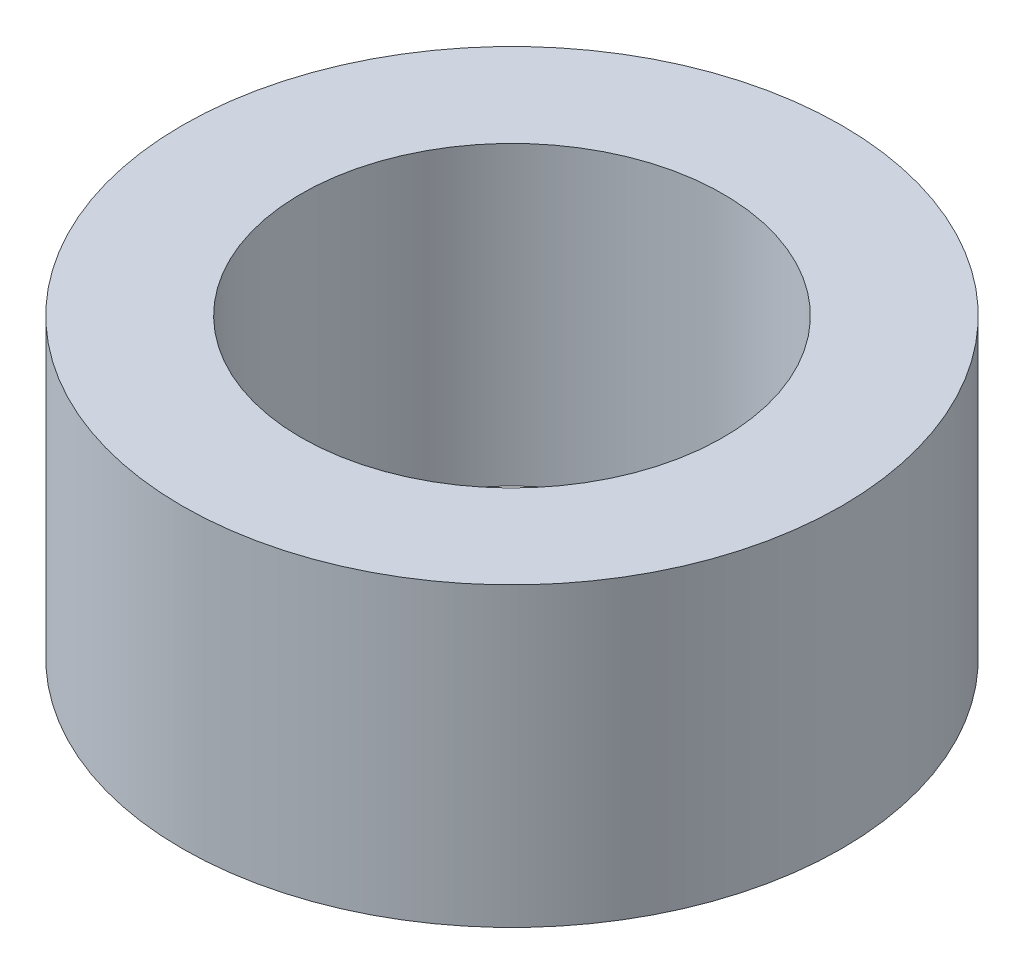
ISO-10303-21;
HEADER;
FILE_DESCRIPTION(('STEP AP214'),'2;1');
FILE_NAME('part.step','',(''),(''),'','','');
FILE_SCHEMA(('AUTOMOTIVE_DESIGN { 1 0 10303 214 1 1 1 1 }'));
ENDSEC;
DATA;
#1=APPLICATION_CONTEXT('core data for automotive mechanical design processes');
#2=APPLICATION_PROTOCOL_DEFINITION('international standard','automotive_design',2000,#1);
#3=PRODUCT_CONTEXT('',#1,'mechanical');
#4=PRODUCT('Part','Part','',(#3));
#5=PRODUCT_RELATED_PRODUCT_CATEGORY('part','',(#4));
#6=PRODUCT_DEFINITION_FORMATION('','',#4);
#7=PRODUCT_DEFINITION_CONTEXT('part definition',#1,'design');
#8=PRODUCT_DEFINITION('design','',#6,#7);
#9=PRODUCT_DEFINITION_SHAPE('','',#8);
#10=(LENGTH_UNIT() NAMED_UNIT(*) SI_UNIT(.MILLI.,.METRE.));
#11=(NAMED_UNIT(*) PLANE_ANGLE_UNIT() SI_UNIT($,.RADIAN.));
#12=(NAMED_UNIT(*) SI_UNIT($,.STERADIAN.) SOLID_ANGLE_UNIT());
#13=UNCERTAINTY_MEASURE_WITH_UNIT(LENGTH_MEASURE(1.E-05),#10,'distance_accuracy_value','');
#14=(GEOMETRIC_REPRESENTATION_CONTEXT(3) GLOBAL_UNCERTAINTY_ASSIGNED_CONTEXT((#13)) GLOBAL_UNIT_ASSIGNED_CONTEXT((#10,
#11,#12)) REPRESENTATION_CONTEXT('',''));
#15=CARTESIAN_POINT('',(0.,0.,0.));
#16=DIRECTION('',(0.,0.,1.));
#17=DIRECTION('',(1.,0.,0.));
#18=AXIS2_PLACEMENT_3D('',#15,#16,#17);
#19=CARTESIAN_POINT('',(0.,4.5,0.));
#20=DIRECTION('',(0.,1.,0.));
#21=DIRECTION('',(0.,0.,1.));
#22=AXIS2_PLACEMENT_3D('',#19,#20,#21);
#23=PLANE('',#22);
#24=CARTESIAN_POINT('',(0.,4.5,0.));
#25=DIRECTION('',(0.,1.,0.));
#26=DIRECTION('',(0.,0.,1.));
#27=AXIS2_PLACEMENT_3D('',#24,#25,#26);
#28=CIRCLE('',#27,5.);
#29=CARTESIAN_POINT('',(0.,4.5,5.));
#30=VERTEX_POINT('',#29);
#31=EDGE_CURVE('E10',#30,#30,#28,.T.);
#32=ORIENTED_EDGE('',*,*,#31,.T.);
#33=EDGE_LOOP('',(#32));
#34=FACE_BOUND('',#33,.T.);
#35=CARTESIAN_POINT('',(0.,4.5,0.));
#36=DIRECTION('',(0.,1.,0.));
#37=DIRECTION('',(0.,0.,1.));
#38=AXIS2_PLACEMENT_3D('',#35,#36,#37);
#39=CIRCLE('',#38,3.2);
#40=CARTESIAN_POINT('',(0.,4.5,3.2));
#41=VERTEX_POINT('',#40);
#42=EDGE_CURVE('E56',#41,#41,#39,.T.);
#43=ORIENTED_EDGE('',*,*,#42,.F.);
#44=EDGE_LOOP('',(#43));
#45=FACE_BOUND('',#44,.T.);
#46=ADVANCED_FACE('F43',(#34,#45),#23,.T.);
#47=CARTESIAN_POINT('',(0.,0.,0.));
#48=DIRECTION('',(0.,1.,0.));
#49=DIRECTION('',(0.,0.,1.));
#50=AXIS2_PLACEMENT_3D('',#47,#48,#49);
#51=PLANE('',#50);
#52=CARTESIAN_POINT('',(0.,0.,0.));
#53=DIRECTION('',(0.,1.,0.));
#54=DIRECTION('',(0.,0.,1.));
#55=AXIS2_PLACEMENT_3D('',#52,#53,#54);
#56=CIRCLE('',#55,5.);
#57=CARTESIAN_POINT('',(0.,0.,5.));
#58=VERTEX_POINT('',#57);
#59=EDGE_CURVE('E47',#58,#58,#56,.T.);
#60=ORIENTED_EDGE('',*,*,#59,.F.);
#61=EDGE_LOOP('',(#60));
#62=FACE_BOUND('',#61,.T.);
#63=CARTESIAN_POINT('',(0.,0.,0.));
#64=DIRECTION('',(0.,1.,0.));
#65=DIRECTION('',(0.,0.,1.));
#66=AXIS2_PLACEMENT_3D('',#63,#64,#65);
#67=CIRCLE('',#66,3.2);
#68=CARTESIAN_POINT('',(0.,0.,3.2));
#69=VERTEX_POINT('',#68);
#70=EDGE_CURVE('E58',#69,#69,#67,.T.);
#71=ORIENTED_EDGE('',*,*,#70,.T.);
#72=EDGE_LOOP('',(#71));
#73=FACE_BOUND('',#72,.T.);
#74=ADVANCED_FACE('F70',(#62,#73),#51,.F.);
#75=CARTESIAN_POINT('',(0.,4.5,0.));
#76=DIRECTION('',(0.,-1.,0.));
#77=DIRECTION('',(0.,0.,-1.));
#78=AXIS2_PLACEMENT_3D('',#75,#76,#77);
#79=CYLINDRICAL_SURFACE('',#78,5.);
#80=ORIENTED_EDGE('',*,*,#31,.F.);
#81=EDGE_LOOP('',(#80));
#82=FACE_BOUND('',#81,.T.);
#83=ORIENTED_EDGE('',*,*,#59,.T.);
#84=EDGE_LOOP('',(#83));
#85=FACE_BOUND('',#84,.T.);
#86=ADVANCED_FACE('F45',(#82,#85),#79,.T.);
#87=CARTESIAN_POINT('',(0.,4.5,0.));
#88=DIRECTION('',(0.,-1.,0.));
#89=DIRECTION('',(0.,0.,-1.));
#90=AXIS2_PLACEMENT_3D('',#87,#88,#89);
#91=CYLINDRICAL_SURFACE('',#90,3.2);
#92=ORIENTED_EDGE('',*,*,#42,.T.);
#93=EDGE_LOOP('',(#92));
#94=FACE_BOUND('',#93,.T.);
#95=ORIENTED_EDGE('',*,*,#70,.F.);
#96=EDGE_LOOP('',(#95));
#97=FACE_BOUND('',#96,.T.);
#98=ADVANCED_FACE('F66',(#94,#97),#91,.F.);
#99=CLOSED_SHELL('',(#46,#74,#86,#98));
#100=MANIFOLD_SOLID_BREP('B2',#99);
#101=ADVANCED_BREP_SHAPE_REPRESENTATION('',(#18,#100),#14);
#102=SHAPE_DEFINITION_REPRESENTATION(#9,#101);
ENDSEC;
END-ISO-10303-21;
